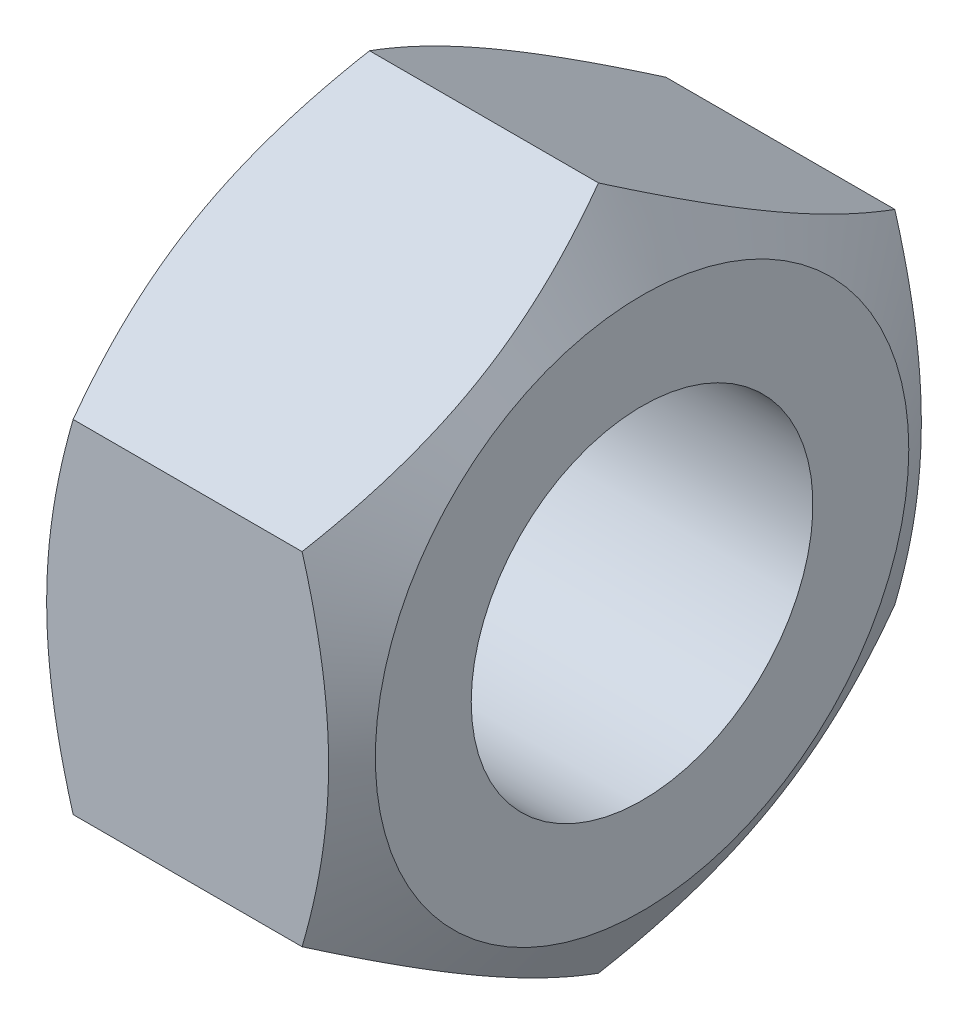
ISO-10303-21;
HEADER;
FILE_DESCRIPTION(('STEP AP214'),'2;1');
FILE_NAME('part.step','',(''),(''),'','','');
FILE_SCHEMA(('AUTOMOTIVE_DESIGN { 1 0 10303 214 1 1 1 1 }'));
ENDSEC;
DATA;
#1=APPLICATION_CONTEXT('core data for automotive mechanical design processes');
#2=APPLICATION_PROTOCOL_DEFINITION('international standard','automotive_design',2000,#1);
#3=PRODUCT_CONTEXT('',#1,'mechanical');
#4=PRODUCT('Part','Part','',(#3));
#5=PRODUCT_RELATED_PRODUCT_CATEGORY('part','',(#4));
#6=PRODUCT_DEFINITION_FORMATION('','',#4);
#7=PRODUCT_DEFINITION_CONTEXT('part definition',#1,'design');
#8=PRODUCT_DEFINITION('design','',#6,#7);
#9=PRODUCT_DEFINITION_SHAPE('','',#8);
#10=(LENGTH_UNIT() NAMED_UNIT(*) SI_UNIT(.MILLI.,.METRE.));
#11=(NAMED_UNIT(*) PLANE_ANGLE_UNIT() SI_UNIT($,.RADIAN.));
#12=(NAMED_UNIT(*) SI_UNIT($,.STERADIAN.) SOLID_ANGLE_UNIT());
#13=UNCERTAINTY_MEASURE_WITH_UNIT(LENGTH_MEASURE(1.E-05),#10,'distance_accuracy_value','');
#14=(GEOMETRIC_REPRESENTATION_CONTEXT(3) GLOBAL_UNCERTAINTY_ASSIGNED_CONTEXT((#13)) GLOBAL_UNIT_ASSIGNED_CONTEXT((#10,
#11,#12)) REPRESENTATION_CONTEXT('',''));
#15=CARTESIAN_POINT('',(0.,0.,0.));
#16=DIRECTION('',(0.,0.,1.));
#17=DIRECTION('',(1.,0.,0.));
#18=AXIS2_PLACEMENT_3D('',#15,#16,#17);
#19=CARTESIAN_POINT('',(17.,-8.66025403784439,15.));
#20=DIRECTION('',(0.,0.866025403784439,-0.5));
#21=DIRECTION('',(-1.,0.,0.));
#22=AXIS2_PLACEMENT_3D('',#19,#20,#21);
#23=PLANE('',#22);
#24=DIRECTION('',(-1.,0.,0.));
#25=VECTOR('',#24,1.);
#26=CARTESIAN_POINT('',(17.,-17.3205080756888,0.));
#27=LINE('',#26,#25);
#28=CARTESIAN_POINT('',(13.79422863406,-17.3205080756888,0.));
#29=VERTEX_POINT('',#28);
#30=CARTESIAN_POINT('',(2.20577136594005,-17.3205080756888,0.));
#31=VERTEX_POINT('',#30);
#32=EDGE_CURVE('E11',#29,#31,#27,.T.);
#33=ORIENTED_EDGE('',*,*,#32,.F.);
#34=CARTESIAN_POINT('',(13.7942286340456,-8.66025403781953,15.0000000000431));
#35=CARTESIAN_POINT('',(16.2942286340707,-12.9903810567666,7.5));
#36=CARTESIAN_POINT('',(13.7942286340456,-17.3205080757137,-4.31137220525149E-11));
#37=(BOUNDED_CURVE() B_SPLINE_CURVE(2,(#34,#35,#36),.UNSPECIFIED.,.F.,
.F.) B_SPLINE_CURVE_WITH_KNOTS((3,3),(-6.08537305030958,-2.70821080534171),
.UNSPECIFIED.) CURVE() GEOMETRIC_REPRESENTATION_ITEM() RATIONAL_B_SPLINE_CURVE((1.80858798800381,
2.08837752345724,1.80858798800381)) REPRESENTATION_ITEM(''));
#38=CARTESIAN_POINT('',(13.7942286340599,-8.66025403784439,15.));
#39=VERTEX_POINT('',#38);
#40=EDGE_CURVE('E156',#39,#29,#37,.T.);
#41=ORIENTED_EDGE('',*,*,#40,.F.);
#42=DIRECTION('',(-1.,0.,0.));
#43=VECTOR('',#42,1.);
#44=CARTESIAN_POINT('',(17.,-8.66025403784439,15.));
#45=LINE('',#44,#43);
#46=CARTESIAN_POINT('',(2.20577136594005,-8.66025403784439,15.));
#47=VERTEX_POINT('',#46);
#48=EDGE_CURVE('E150',#39,#47,#45,.T.);
#49=ORIENTED_EDGE('',*,*,#48,.T.);
#50=CARTESIAN_POINT('',(2.20577136594874,-17.3205080757038,-2.61019454624323E-11));
#51=CARTESIAN_POINT('',(-0.294228634066468,-12.9903810567666,7.49999999999999));
#52=CARTESIAN_POINT('',(2.20577136594874,-8.66025403782932,15.0000000000261));
#53=(BOUNDED_CURVE() B_SPLINE_CURVE(2,(#50,#51,#52),.UNSPECIFIED.,.F.,
.F.) B_SPLINE_CURVE_WITH_KNOTS((3,3),(-5.81430207459458,-2.54800531771193),
.UNSPECIFIED.) CURVE() GEOMETRIC_REPRESENTATION_ITEM() RATIONAL_B_SPLINE_CURVE((1.75329004956109,
2.02452496416493,1.75329004956109)) REPRESENTATION_ITEM(''));
#54=EDGE_CURVE('E132',#31,#47,#53,.T.);
#55=ORIENTED_EDGE('',*,*,#54,.F.);
#56=EDGE_LOOP('',(#33,#41,#49,#55));
#57=FACE_BOUND('',#56,.T.);
#58=ADVANCED_FACE('F17',(#57),#23,.F.);
#59=CARTESIAN_POINT('',(17.,-17.3205080756888,0.));
#60=DIRECTION('',(0.,0.866025403784439,0.5));
#61=DIRECTION('',(1.,0.,0.));
#62=AXIS2_PLACEMENT_3D('',#59,#60,#61);
#63=PLANE('',#62);
#64=DIRECTION('',(-1.,0.,0.));
#65=VECTOR('',#64,1.);
#66=CARTESIAN_POINT('',(17.,-8.66025403784439,-15.));
#67=LINE('',#66,#65);
#68=CARTESIAN_POINT('',(13.7942286340599,-8.66025403784439,-15.));
#69=VERTEX_POINT('',#68);
#70=CARTESIAN_POINT('',(2.20577136594005,-8.66025403784439,-15.));
#71=VERTEX_POINT('',#70);
#72=EDGE_CURVE('E21',#69,#71,#67,.T.);
#73=ORIENTED_EDGE('',*,*,#72,.F.);
#74=CARTESIAN_POINT('',(13.7942286340456,-17.3205080757137,4.30930962970224E-11));
#75=CARTESIAN_POINT('',(16.2942286340707,-12.9903810567666,-7.50000000000002));
#76=CARTESIAN_POINT('',(13.7942286340456,-8.66025403781953,-15.0000000000431));
#77=(BOUNDED_CURVE() B_SPLINE_CURVE(2,(#74,#75,#76),.UNSPECIFIED.,.F.,
.F.) B_SPLINE_CURVE_WITH_KNOTS((3,3),(-6.08537305030958,-2.70821080534171),
.UNSPECIFIED.) CURVE() GEOMETRIC_REPRESENTATION_ITEM() RATIONAL_B_SPLINE_CURVE((1.80858798800381,
2.08837752345724,1.80858798800381)) REPRESENTATION_ITEM(''));
#78=EDGE_CURVE('E165',#29,#69,#77,.T.);
#79=ORIENTED_EDGE('',*,*,#78,.F.);
#80=ORIENTED_EDGE('',*,*,#32,.T.);
#81=CARTESIAN_POINT('',(2.20577136594875,-8.66025403782935,-15.0000000000261));
#82=CARTESIAN_POINT('',(-0.294228634066454,-12.9903810567666,-7.50000000000001));
#83=CARTESIAN_POINT('',(2.20577136594875,-17.3205080757039,2.60958665247009E-11));
#84=(BOUNDED_CURVE() B_SPLINE_CURVE(2,(#81,#82,#83),.UNSPECIFIED.,.F.,
.F.) B_SPLINE_CURVE_WITH_KNOTS((3,3),(-5.81430207459458,-2.54800531771193),
.UNSPECIFIED.) CURVE() GEOMETRIC_REPRESENTATION_ITEM() RATIONAL_B_SPLINE_CURVE((1.75329004956109,
2.02452496416493,1.75329004956109)) REPRESENTATION_ITEM(''));
#85=EDGE_CURVE('E235',#71,#31,#84,.T.);
#86=ORIENTED_EDGE('',*,*,#85,.F.);
#87=EDGE_LOOP('',(#73,#79,#80,#86));
#88=FACE_BOUND('',#87,.T.);
#89=ADVANCED_FACE('F19',(#88),#63,.F.);
#90=CARTESIAN_POINT('',(17.,-8.66025403784439,-15.));
#91=DIRECTION('',(0.,0.,1.));
#92=DIRECTION('',(1.,0.,0.));
#93=AXIS2_PLACEMENT_3D('',#90,#91,#92);
#94=PLANE('',#93);
#95=DIRECTION('',(-1.,0.,0.));
#96=VECTOR('',#95,1.);
#97=CARTESIAN_POINT('',(17.,8.66025403784439,-15.));
#98=LINE('',#97,#96);
#99=CARTESIAN_POINT('',(13.7942286340599,8.66025403784439,-15.));
#100=VERTEX_POINT('',#99);
#101=CARTESIAN_POINT('',(2.20577136594005,8.66025403784439,-15.));
#102=VERTEX_POINT('',#101);
#103=EDGE_CURVE('E48',#100,#102,#98,.T.);
#104=ORIENTED_EDGE('',*,*,#103,.F.);
#105=CARTESIAN_POINT('',(15.1339745962156,0.,-15.));
#106=CARTESIAN_POINT('',(15.1339745962156,4.01923788648686,-15.));
#107=CARTESIAN_POINT('',(13.7942286340456,8.6602540378942,-15.));
#108=(BOUNDED_CURVE() B_SPLINE_CURVE(2,(#105,#106,#107),.UNSPECIFIED.,.F.,
.F.) B_SPLINE_CURVE_WITH_KNOTS((3,3),(-4.39679192782565,-2.70821080534171),
.UNSPECIFIED.) CURVE() GEOMETRIC_REPRESENTATION_ITEM() RATIONAL_B_SPLINE_CURVE((1.94848275573053,
1.94848275573053,1.80858798800381)) REPRESENTATION_ITEM(''));
#109=CARTESIAN_POINT('',(15.1339745962156,0.,-15.));
#110=VERTEX_POINT('',#109);
#111=EDGE_CURVE('E193',#110,#100,#108,.T.);
#112=ORIENTED_EDGE('',*,*,#111,.F.);
#113=CARTESIAN_POINT('',(13.7942286340456,-8.6602540378942,-15.));
#114=CARTESIAN_POINT('',(15.1339745962156,-4.01923788648686,-15.));
#115=CARTESIAN_POINT('',(15.1339745962156,0.,-15.));
#116=(BOUNDED_CURVE() B_SPLINE_CURVE(2,(#113,#114,#115),.UNSPECIFIED.,.F.,
.F.) B_SPLINE_CURVE_WITH_KNOTS((3,3),(-6.08537305030959,-4.39679192782565),
.UNSPECIFIED.) CURVE() GEOMETRIC_REPRESENTATION_ITEM() RATIONAL_B_SPLINE_CURVE((1.80858798800381,
1.94848275573053,1.94848275573053)) REPRESENTATION_ITEM(''));
#117=EDGE_CURVE('E166',#69,#110,#116,.T.);
#118=ORIENTED_EDGE('',*,*,#117,.F.);
#119=ORIENTED_EDGE('',*,*,#72,.T.);
#120=CARTESIAN_POINT('',(2.20577136594875,8.66025403787454,-15.));
#121=CARTESIAN_POINT('',(-0.294228634066481,0.,-15.));
#122=CARTESIAN_POINT('',(2.20577136594874,-8.66025403787454,-15.));
#123=(BOUNDED_CURVE() B_SPLINE_CURVE(2,(#120,#121,#122),.UNSPECIFIED.,.F.,
.F.) B_SPLINE_CURVE_WITH_KNOTS((3,3),(-5.81458807106552,-2.54817453781228),
.UNSPECIFIED.) CURVE() GEOMETRIC_REPRESENTATION_ITEM() RATIONAL_B_SPLINE_CURVE((1.75334829095714,
2.02459221553632,1.75334829095714)) REPRESENTATION_ITEM(''));
#124=EDGE_CURVE('E230',#102,#71,#123,.T.);
#125=ORIENTED_EDGE('',*,*,#124,.F.);
#126=EDGE_LOOP('',(#104,#112,#118,#119,#125));
#127=FACE_BOUND('',#126,.T.);
#128=ADVANCED_FACE('F228',(#127),#94,.F.);
#129=CARTESIAN_POINT('',(17.,8.66025403784439,-15.));
#130=DIRECTION('',(0.,-0.866025403784439,0.5));
#131=DIRECTION('',(-1.,0.,0.));
#132=AXIS2_PLACEMENT_3D('',#129,#130,#131);
#133=PLANE('',#132);
#134=DIRECTION('',(-1.,0.,0.));
#135=VECTOR('',#134,1.);
#136=CARTESIAN_POINT('',(17.,17.3205080756888,0.));
#137=LINE('',#136,#135);
#138=CARTESIAN_POINT('',(13.7942286340599,17.3205080756888,0.));
#139=VERTEX_POINT('',#138);
#140=CARTESIAN_POINT('',(2.20577136594005,17.3205080756888,0.));
#141=VERTEX_POINT('',#140);
#142=EDGE_CURVE('E149',#139,#141,#137,.T.);
#143=ORIENTED_EDGE('',*,*,#142,.F.);
#144=CARTESIAN_POINT('',(13.7942286340456,8.66025403781953,-15.0000000000431));
#145=CARTESIAN_POINT('',(16.2942286340707,12.9903810567666,-7.49999999999997));
#146=CARTESIAN_POINT('',(13.7942286340456,17.3205080757137,4.31441695963374E-11));
#147=(BOUNDED_CURVE() B_SPLINE_CURVE(2,(#144,#145,#146),.UNSPECIFIED.,.F.,
.F.) B_SPLINE_CURVE_WITH_KNOTS((3,3),(-6.08537305030958,-2.70821080534171),
.UNSPECIFIED.) CURVE() GEOMETRIC_REPRESENTATION_ITEM() RATIONAL_B_SPLINE_CURVE((1.80858798800381,
2.08837752345724,1.80858798800381)) REPRESENTATION_ITEM(''));
#148=EDGE_CURVE('E199',#100,#139,#147,.T.);
#149=ORIENTED_EDGE('',*,*,#148,.F.);
#150=ORIENTED_EDGE('',*,*,#103,.T.);
#151=CARTESIAN_POINT('',(2.20577136594874,17.3205080757038,2.61019454624323E-11));
#152=CARTESIAN_POINT('',(-0.294228634066468,12.9903810567666,-7.49999999999999));
#153=CARTESIAN_POINT('',(2.20577136594874,8.66025403782932,-15.0000000000261));
#154=(BOUNDED_CURVE() B_SPLINE_CURVE(2,(#151,#152,#153),.UNSPECIFIED.,.F.,
.F.) B_SPLINE_CURVE_WITH_KNOTS((3,3),(-5.81430207459458,-2.54800531771193),
.UNSPECIFIED.) CURVE() GEOMETRIC_REPRESENTATION_ITEM() RATIONAL_B_SPLINE_CURVE((1.75329004956109,
2.02452496416493,1.75329004956109)) REPRESENTATION_ITEM(''));
#155=EDGE_CURVE('E239',#141,#102,#154,.T.);
#156=ORIENTED_EDGE('',*,*,#155,.F.);
#157=EDGE_LOOP('',(#143,#149,#150,#156));
#158=FACE_BOUND('',#157,.T.);
#159=ADVANCED_FACE('F317',(#158),#133,.F.);
#160=CARTESIAN_POINT('',(17.,17.3205080756888,0.));
#161=DIRECTION('',(0.,-0.866025403784439,-0.5));
#162=DIRECTION('',(0.,0.5,-0.866025403784439));
#163=AXIS2_PLACEMENT_3D('',#160,#161,#162);
#164=PLANE('',#163);
#165=DIRECTION('',(-1.,0.,0.));
#166=VECTOR('',#165,1.);
#167=CARTESIAN_POINT('',(17.,8.66025403784439,15.));
#168=LINE('',#167,#166);
#169=CARTESIAN_POINT('',(13.7942286340599,8.66025403784439,15.));
#170=VERTEX_POINT('',#169);
#171=CARTESIAN_POINT('',(2.20577136594005,8.66025403784439,15.));
#172=VERTEX_POINT('',#171);
#173=EDGE_CURVE('E143',#170,#172,#168,.T.);
#174=ORIENTED_EDGE('',*,*,#173,.F.);
#175=CARTESIAN_POINT('',(13.7942286340456,17.3205080757137,-4.31284547350097E-11));
#176=CARTESIAN_POINT('',(16.2942286340707,12.9903810567666,7.5));
#177=CARTESIAN_POINT('',(13.7942286340456,8.66025403781953,15.0000000000431));
#178=(BOUNDED_CURVE() B_SPLINE_CURVE(2,(#175,#176,#177),.UNSPECIFIED.,.F.,
.F.) B_SPLINE_CURVE_WITH_KNOTS((3,3),(-6.08537305030958,-2.70821080534171),
.UNSPECIFIED.) CURVE() GEOMETRIC_REPRESENTATION_ITEM() RATIONAL_B_SPLINE_CURVE((1.80858798800381,
2.08837752345724,1.80858798800381)) REPRESENTATION_ITEM(''));
#179=EDGE_CURVE('E129',#139,#170,#178,.T.);
#180=ORIENTED_EDGE('',*,*,#179,.F.);
#181=ORIENTED_EDGE('',*,*,#142,.T.);
#182=CARTESIAN_POINT('',(2.20577136594875,8.66025403782935,15.0000000000261));
#183=CARTESIAN_POINT('',(-0.294228634066454,12.9903810567666,7.50000000000001));
#184=CARTESIAN_POINT('',(2.20577136594875,17.3205080757039,-2.60958665247009E-11));
#185=(BOUNDED_CURVE() B_SPLINE_CURVE(2,(#182,#183,#184),.UNSPECIFIED.,.F.,
.F.) B_SPLINE_CURVE_WITH_KNOTS((3,3),(-5.81430207459458,-2.54800531771193),
.UNSPECIFIED.) CURVE() GEOMETRIC_REPRESENTATION_ITEM() RATIONAL_B_SPLINE_CURVE((1.75329004956109,
2.02452496416493,1.75329004956109)) REPRESENTATION_ITEM(''));
#186=EDGE_CURVE('E244',#172,#141,#185,.T.);
#187=ORIENTED_EDGE('',*,*,#186,.F.);
#188=EDGE_LOOP('',(#174,#180,#181,#187));
#189=FACE_BOUND('',#188,.T.);
#190=ADVANCED_FACE('F315',(#189),#164,.F.);
#191=CARTESIAN_POINT('',(17.,8.66025403784439,15.));
#192=DIRECTION('',(0.,0.,-1.));
#193=DIRECTION('',(0.,-1.,0.));
#194=AXIS2_PLACEMENT_3D('',#191,#192,#193);
#195=PLANE('',#194);
#196=ORIENTED_EDGE('',*,*,#48,.F.);
#197=CARTESIAN_POINT('',(13.7942286340456,8.6602540378942,15.));
#198=CARTESIAN_POINT('',(16.2942286340707,0.,15.));
#199=CARTESIAN_POINT('',(13.7942286340456,-8.6602540378942,15.));
#200=(BOUNDED_CURVE() B_SPLINE_CURVE(2,(#197,#198,#199),.UNSPECIFIED.,.F.,
.F.) B_SPLINE_CURVE_WITH_KNOTS((3,3),(-6.08537305030959,-2.70821080534171),
.UNSPECIFIED.) CURVE() GEOMETRIC_REPRESENTATION_ITEM() RATIONAL_B_SPLINE_CURVE((1.80858798800381,
2.08837752345725,1.80858798800381)) REPRESENTATION_ITEM(''));
#201=EDGE_CURVE('E142',#170,#39,#200,.T.);
#202=ORIENTED_EDGE('',*,*,#201,.F.);
#203=ORIENTED_EDGE('',*,*,#173,.T.);
#204=CARTESIAN_POINT('',(0.866025403784429,0.,15.));
#205=CARTESIAN_POINT('',(0.866025403784429,4.01923788647896,15.));
#206=CARTESIAN_POINT('',(2.20577136594874,8.66025403787454,15.));
#207=(BOUNDED_CURVE() B_SPLINE_CURVE(2,(#204,#205,#206),.UNSPECIFIED.,.F.,
.F.) B_SPLINE_CURVE_WITH_KNOTS((3,3),(-4.1813813044389,-2.54817453781228),
.UNSPECIFIED.) CURVE() GEOMETRIC_REPRESENTATION_ITEM() RATIONAL_B_SPLINE_CURVE((1.88897025324673,
1.88897025324673,1.75334829095714)) REPRESENTATION_ITEM(''));
#208=CARTESIAN_POINT('',(0.866025403784429,0.,15.));
#209=VERTEX_POINT('',#208);
#210=EDGE_CURVE('E124',#209,#172,#207,.T.);
#211=ORIENTED_EDGE('',*,*,#210,.F.);
#212=CARTESIAN_POINT('',(2.20577136594875,-8.66025403787454,15.));
#213=CARTESIAN_POINT('',(0.866025403784429,-4.01923788647896,15.));
#214=CARTESIAN_POINT('',(0.866025403784429,0.,15.));
#215=(BOUNDED_CURVE() B_SPLINE_CURVE(2,(#212,#213,#214),.UNSPECIFIED.,.F.,
.F.) B_SPLINE_CURVE_WITH_KNOTS((3,3),(-5.81458807106552,-4.1813813044389),
.UNSPECIFIED.) CURVE() GEOMETRIC_REPRESENTATION_ITEM() RATIONAL_B_SPLINE_CURVE((1.75334829095714,
1.88897025324673,1.88897025324673)) REPRESENTATION_ITEM(''));
#216=EDGE_CURVE('E121',#47,#209,#215,.T.);
#217=ORIENTED_EDGE('',*,*,#216,.F.);
#218=EDGE_LOOP('',(#196,#202,#203,#211,#217));
#219=FACE_BOUND('',#218,.T.);
#220=ADVANCED_FACE('F312',(#219),#195,.F.);
#221=CARTESIAN_POINT('',(16.,0.,0.));
#222=DIRECTION('',(1.,0.,0.));
#223=DIRECTION('',(0.,0.,-1.));
#224=AXIS2_PLACEMENT_3D('',#221,#222,#223);
#225=CYLINDRICAL_SURFACE('',#224,8.647);
#226=CARTESIAN_POINT('',(0.,0.,0.));
#227=DIRECTION('',(1.,0.,0.));
#228=DIRECTION('',(0.,0.,-1.));
#229=AXIS2_PLACEMENT_3D('',#226,#227,#228);
#230=CIRCLE('',#229,8.647);
#231=CARTESIAN_POINT('',(0.,0.,8.647));
#232=VERTEX_POINT('',#231);
#233=EDGE_CURVE('E277',#232,#232,#230,.T.);
#234=ORIENTED_EDGE('',*,*,#233,.F.);
#235=DIRECTION('',(1.,0.,0.));
#236=VECTOR('',#235,1.);
#237=CARTESIAN_POINT('',(16.,0.,8.647));
#238=LINE('',#237,#236);
#239=CARTESIAN_POINT('',(16.,0.,8.647));
#240=VERTEX_POINT('',#239);
#241=EDGE_CURVE('E39',#232,#240,#238,.T.);
#242=ORIENTED_EDGE('',*,*,#241,.T.);
#243=CARTESIAN_POINT('',(16.,0.,0.));
#244=DIRECTION('',(1.,0.,0.));
#245=DIRECTION('',(0.,0.,-1.));
#246=AXIS2_PLACEMENT_3D('',#243,#244,#245);
#247=CIRCLE('',#246,8.647);
#248=EDGE_CURVE('E208',#240,#240,#247,.T.);
#249=ORIENTED_EDGE('',*,*,#248,.T.);
#250=ORIENTED_EDGE('',*,*,#241,.F.);
#251=EDGE_LOOP('',(#234,#242,#249,#250));
#252=FACE_BOUND('',#251,.T.);
#253=ADVANCED_FACE('F297',(#252),#225,.F.);
#254=CARTESIAN_POINT('',(16.,13.5,0.));
#255=DIRECTION('',(-1.,0.,0.));
#256=DIRECTION('',(0.,0.,1.));
#257=AXIS2_PLACEMENT_3D('',#254,#255,#256);
#258=PLANE('',#257);
#259=ORIENTED_EDGE('',*,*,#248,.F.);
#260=EDGE_LOOP('',(#259));
#261=FACE_BOUND('',#260,.T.);
#262=CARTESIAN_POINT('',(16.,0.,0.));
#263=DIRECTION('',(1.,0.,0.));
#264=DIRECTION('',(0.,0.,-1.));
#265=AXIS2_PLACEMENT_3D('',#262,#263,#264);
#266=CIRCLE('',#265,13.5);
#267=CARTESIAN_POINT('',(16.,0.,-13.5));
#268=VERTEX_POINT('',#267);
#269=EDGE_CURVE('E189',#268,#268,#266,.T.);
#270=ORIENTED_EDGE('',*,*,#269,.T.);
#271=EDGE_LOOP('',(#270));
#272=FACE_BOUND('',#271,.T.);
#273=ADVANCED_FACE('F300',(#261,#272),#258,.F.);
#274=CARTESIAN_POINT('',(13.4019237886467,0.,0.));
#275=DIRECTION('',(-1.,0.,0.));
#276=DIRECTION('',(0.,0.,1.));
#277=AXIS2_PLACEMENT_3D('',#274,#275,#276);
#278=CONICAL_SURFACE('',#277,18.,1.0471975511966);
#279=ORIENTED_EDGE('',*,*,#179,.T.);
#280=ORIENTED_EDGE('',*,*,#201,.T.);
#281=ORIENTED_EDGE('',*,*,#40,.T.);
#282=ORIENTED_EDGE('',*,*,#78,.T.);
#283=ORIENTED_EDGE('',*,*,#117,.T.);
#284=DIRECTION('',(0.5,0.,0.86602540378444));
#285=VECTOR('',#284,1.);
#286=CARTESIAN_POINT('',(13.4019237886467,0.,-18.));
#287=LINE('',#286,#285);
#288=EDGE_CURVE('E175',#110,#268,#287,.T.);
#289=ORIENTED_EDGE('',*,*,#288,.T.);
#290=ORIENTED_EDGE('',*,*,#269,.F.);
#291=ORIENTED_EDGE('',*,*,#288,.F.);
#292=ORIENTED_EDGE('',*,*,#111,.T.);
#293=ORIENTED_EDGE('',*,*,#148,.T.);
#294=EDGE_LOOP('',(#279,#280,#281,#282,#283,#289,#290,#291,#292,#293));
#295=FACE_BOUND('',#294,.T.);
#296=ADVANCED_FACE('F303',(#295),#278,.T.);
#297=CARTESIAN_POINT('',(0.,0.,0.));
#298=DIRECTION('',(1.,0.,0.));
#299=DIRECTION('',(0.,0.,-1.));
#300=AXIS2_PLACEMENT_3D('',#297,#298,#299);
#301=CONICAL_SURFACE('',#300,13.5,1.0471975511966);
#302=ORIENTED_EDGE('',*,*,#186,.T.);
#303=ORIENTED_EDGE('',*,*,#155,.T.);
#304=ORIENTED_EDGE('',*,*,#124,.T.);
#305=ORIENTED_EDGE('',*,*,#85,.T.);
#306=ORIENTED_EDGE('',*,*,#54,.T.);
#307=ORIENTED_EDGE('',*,*,#216,.T.);
#308=DIRECTION('',(-0.5,0.,-0.86602540378444));
#309=VECTOR('',#308,1.);
#310=CARTESIAN_POINT('',(0.,0.,13.5));
#311=LINE('',#310,#309);
#312=CARTESIAN_POINT('',(0.,0.,13.5));
#313=VERTEX_POINT('',#312);
#314=EDGE_CURVE('E114',#209,#313,#311,.T.);
#315=ORIENTED_EDGE('',*,*,#314,.T.);
#316=CARTESIAN_POINT('',(0.,0.,0.));
#317=DIRECTION('',(1.,0.,0.));
#318=DIRECTION('',(0.,0.,-1.));
#319=AXIS2_PLACEMENT_3D('',#316,#317,#318);
#320=CIRCLE('',#319,13.5);
#321=EDGE_CURVE('E118',#313,#313,#320,.T.);
#322=ORIENTED_EDGE('',*,*,#321,.T.);
#323=ORIENTED_EDGE('',*,*,#314,.F.);
#324=ORIENTED_EDGE('',*,*,#210,.T.);
#325=EDGE_LOOP('',(#302,#303,#304,#305,#306,#307,#315,#322,#323,#324));
#326=FACE_BOUND('',#325,.T.);
#327=ADVANCED_FACE('F116',(#326),#301,.T.);
#328=CARTESIAN_POINT('',(0.,0.,0.));
#329=DIRECTION('',(1.,0.,0.));
#330=DIRECTION('',(0.,1.,0.));
#331=AXIS2_PLACEMENT_3D('',#328,#329,#330);
#332=PLANE('',#331);
#333=ORIENTED_EDGE('',*,*,#233,.T.);
#334=EDGE_LOOP('',(#333));
#335=FACE_BOUND('',#334,.T.);
#336=ORIENTED_EDGE('',*,*,#321,.F.);
#337=EDGE_LOOP('',(#336));
#338=FACE_BOUND('',#337,.T.);
#339=ADVANCED_FACE('F295',(#335,#338),#332,.F.);
#340=CLOSED_SHELL('',(#58,#89,#128,#159,#190,#220,#253,#273,#296,#327,#339));
#341=MANIFOLD_SOLID_BREP('B1',#340);
#342=ADVANCED_BREP_SHAPE_REPRESENTATION('',(#18,#341),#14);
#343=SHAPE_DEFINITION_REPRESENTATION(#9,#342);
ENDSEC;
END-ISO-10303-21;
